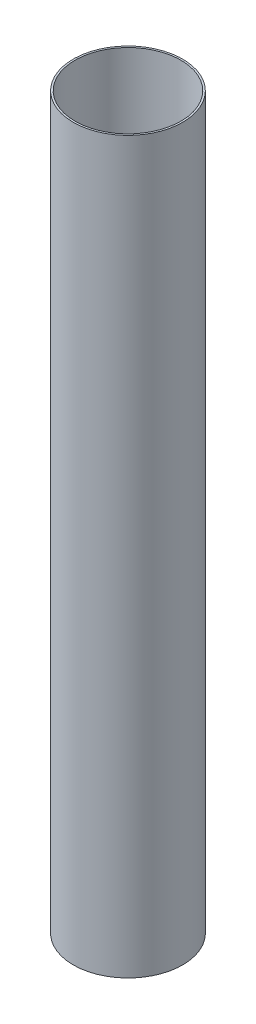
ISO-10303-21;
HEADER;
FILE_DESCRIPTION(('STEP AP214'),'2;1');
FILE_NAME('part.step','',(''),(''),'','','');
FILE_SCHEMA(('AUTOMOTIVE_DESIGN { 1 0 10303 214 1 1 1 1 }'));
ENDSEC;
DATA;
#1=APPLICATION_CONTEXT('core data for automotive mechanical design processes');
#2=APPLICATION_PROTOCOL_DEFINITION('international standard','automotive_design',2000,#1);
#3=PRODUCT_CONTEXT('',#1,'mechanical');
#4=PRODUCT('Part','Part','',(#3));
#5=PRODUCT_RELATED_PRODUCT_CATEGORY('part','',(#4));
#6=PRODUCT_DEFINITION_FORMATION('','',#4);
#7=PRODUCT_DEFINITION_CONTEXT('part definition',#1,'design');
#8=PRODUCT_DEFINITION('design','',#6,#7);
#9=PRODUCT_DEFINITION_SHAPE('','',#8);
#10=(LENGTH_UNIT() NAMED_UNIT(*) SI_UNIT(.MILLI.,.METRE.));
#11=(NAMED_UNIT(*) PLANE_ANGLE_UNIT() SI_UNIT($,.RADIAN.));
#12=(NAMED_UNIT(*) SI_UNIT($,.STERADIAN.) SOLID_ANGLE_UNIT());
#13=UNCERTAINTY_MEASURE_WITH_UNIT(LENGTH_MEASURE(1.E-05),#10,'distance_accuracy_value','');
#14=(GEOMETRIC_REPRESENTATION_CONTEXT(3) GLOBAL_UNCERTAINTY_ASSIGNED_CONTEXT((#13)) GLOBAL_UNIT_ASSIGNED_CONTEXT((#10,
#11,#12)) REPRESENTATION_CONTEXT('',''));
#15=CARTESIAN_POINT('',(0.,0.,0.));
#16=DIRECTION('',(0.,0.,1.));
#17=DIRECTION('',(1.,0.,0.));
#18=AXIS2_PLACEMENT_3D('',#15,#16,#17);
#19=CARTESIAN_POINT('',(0.,254.,0.));
#20=DIRECTION('',(0.,1.,0.));
#21=DIRECTION('',(0.,0.,1.));
#22=AXIS2_PLACEMENT_3D('',#19,#20,#21);
#23=PLANE('',#22);
#24=CARTESIAN_POINT('',(0.,254.,0.));
#25=DIRECTION('',(0.,1.,0.));
#26=DIRECTION('',(0.,0.,1.));
#27=AXIS2_PLACEMENT_3D('',#24,#25,#26);
#28=CIRCLE('',#27,38.1);
#29=CARTESIAN_POINT('',(0.,254.,38.1));
#30=VERTEX_POINT('',#29);
#31=EDGE_CURVE('E10',#30,#30,#28,.T.);
#32=ORIENTED_EDGE('',*,*,#31,.T.);
#33=EDGE_LOOP('',(#32));
#34=FACE_BOUND('',#33,.T.);
#35=CARTESIAN_POINT('',(0.,254.,0.));
#36=DIRECTION('',(0.,1.,0.));
#37=DIRECTION('',(0.,0.,1.));
#38=AXIS2_PLACEMENT_3D('',#35,#36,#37);
#39=CIRCLE('',#38,36.83);
#40=CARTESIAN_POINT('',(0.,254.,36.83));
#41=VERTEX_POINT('',#40);
#42=EDGE_CURVE('E49',#41,#41,#39,.T.);
#43=ORIENTED_EDGE('',*,*,#42,.F.);
#44=EDGE_LOOP('',(#43));
#45=FACE_BOUND('',#44,.T.);
#46=ADVANCED_FACE('F35',(#34,#45),#23,.T.);
#47=CARTESIAN_POINT('',(0.,-254.,0.));
#48=DIRECTION('',(0.,1.,0.));
#49=DIRECTION('',(0.,0.,1.));
#50=AXIS2_PLACEMENT_3D('',#47,#48,#49);
#51=PLANE('',#50);
#52=CARTESIAN_POINT('',(0.,-254.,0.));
#53=DIRECTION('',(0.,1.,0.));
#54=DIRECTION('',(0.,0.,1.));
#55=AXIS2_PLACEMENT_3D('',#52,#53,#54);
#56=CIRCLE('',#55,38.1);
#57=CARTESIAN_POINT('',(0.,-254.,38.1));
#58=VERTEX_POINT('',#57);
#59=EDGE_CURVE('E39',#58,#58,#56,.T.);
#60=ORIENTED_EDGE('',*,*,#59,.F.);
#61=EDGE_LOOP('',(#60));
#62=FACE_BOUND('',#61,.T.);
#63=CARTESIAN_POINT('',(0.,-254.,0.));
#64=DIRECTION('',(0.,1.,0.));
#65=DIRECTION('',(0.,0.,1.));
#66=AXIS2_PLACEMENT_3D('',#63,#64,#65);
#67=CIRCLE('',#66,36.83);
#68=CARTESIAN_POINT('',(0.,-254.,36.83));
#69=VERTEX_POINT('',#68);
#70=EDGE_CURVE('E51',#69,#69,#67,.T.);
#71=ORIENTED_EDGE('',*,*,#70,.T.);
#72=EDGE_LOOP('',(#71));
#73=FACE_BOUND('',#72,.T.);
#74=ADVANCED_FACE('F64',(#62,#73),#51,.F.);
#75=CARTESIAN_POINT('',(0.,254.,0.));
#76=DIRECTION('',(0.,-1.,0.));
#77=DIRECTION('',(0.,0.,-1.));
#78=AXIS2_PLACEMENT_3D('',#75,#76,#77);
#79=CYLINDRICAL_SURFACE('',#78,38.1);
#80=ORIENTED_EDGE('',*,*,#31,.F.);
#81=EDGE_LOOP('',(#80));
#82=FACE_BOUND('',#81,.T.);
#83=ORIENTED_EDGE('',*,*,#59,.T.);
#84=EDGE_LOOP('',(#83));
#85=FACE_BOUND('',#84,.T.);
#86=ADVANCED_FACE('F37',(#82,#85),#79,.T.);
#87=CARTESIAN_POINT('',(0.,254.,0.));
#88=DIRECTION('',(0.,-1.,0.));
#89=DIRECTION('',(0.,0.,-1.));
#90=AXIS2_PLACEMENT_3D('',#87,#88,#89);
#91=CYLINDRICAL_SURFACE('',#90,36.83);
#92=ORIENTED_EDGE('',*,*,#42,.T.);
#93=EDGE_LOOP('',(#92));
#94=FACE_BOUND('',#93,.T.);
#95=ORIENTED_EDGE('',*,*,#70,.F.);
#96=EDGE_LOOP('',(#95));
#97=FACE_BOUND('',#96,.T.);
#98=ADVANCED_FACE('F60',(#94,#97),#91,.F.);
#99=CLOSED_SHELL('',(#46,#74,#86,#98));
#100=MANIFOLD_SOLID_BREP('B2',#99);
#101=ADVANCED_BREP_SHAPE_REPRESENTATION('',(#18,#100),#14);
#102=SHAPE_DEFINITION_REPRESENTATION(#9,#101);
ENDSEC;
END-ISO-10303-21;
